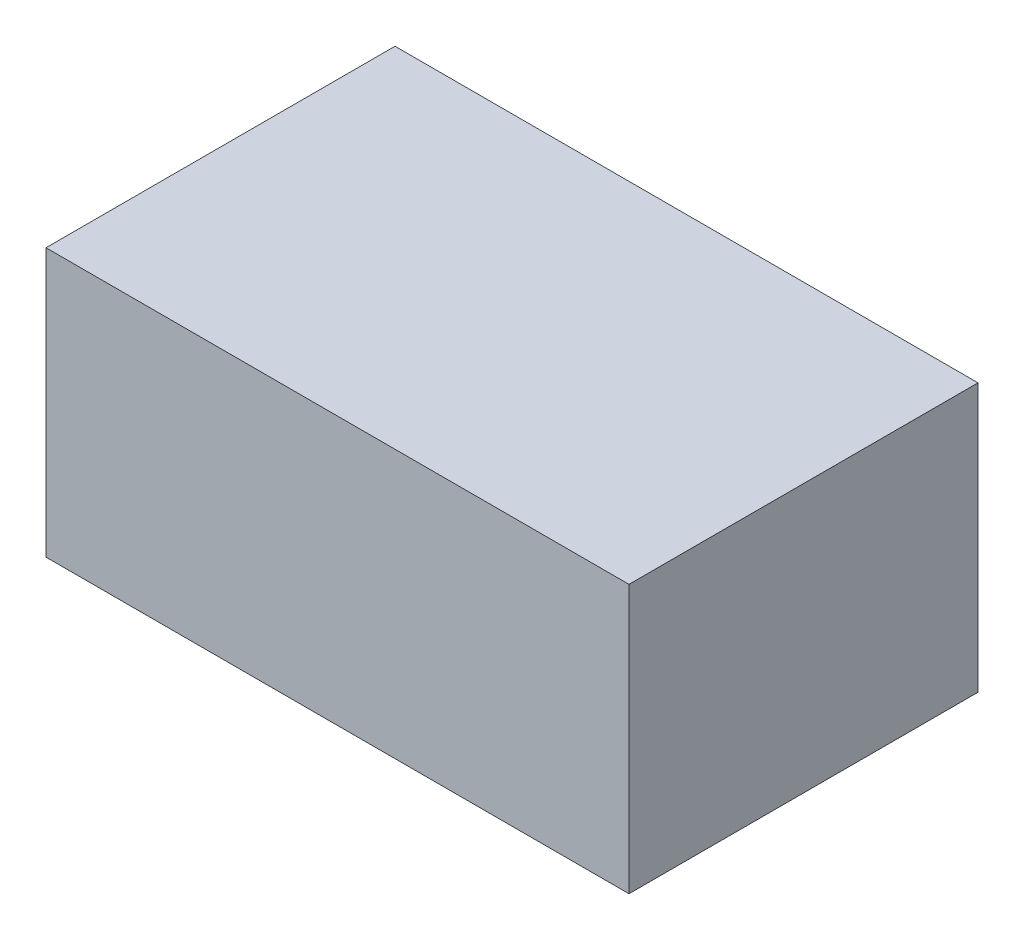
ISO-10303-21;
HEADER;
FILE_DESCRIPTION(('STEP AP214'),'2;1');
FILE_NAME('part.step','',(''),(''),'','','');
FILE_SCHEMA(('AUTOMOTIVE_DESIGN { 1 0 10303 214 1 1 1 1 }'));
ENDSEC;
DATA;
#1=APPLICATION_CONTEXT('core data for automotive mechanical design processes');
#2=APPLICATION_PROTOCOL_DEFINITION('international standard','automotive_design',2000,#1);
#3=PRODUCT_CONTEXT('',#1,'mechanical');
#4=PRODUCT('Part','Part','',(#3));
#5=PRODUCT_RELATED_PRODUCT_CATEGORY('part','',(#4));
#6=PRODUCT_DEFINITION_FORMATION('','',#4);
#7=PRODUCT_DEFINITION_CONTEXT('part definition',#1,'design');
#8=PRODUCT_DEFINITION('design','',#6,#7);
#9=PRODUCT_DEFINITION_SHAPE('','',#8);
#10=(LENGTH_UNIT() NAMED_UNIT(*) SI_UNIT(.MILLI.,.METRE.));
#11=(NAMED_UNIT(*) PLANE_ANGLE_UNIT() SI_UNIT($,.RADIAN.));
#12=(NAMED_UNIT(*) SI_UNIT($,.STERADIAN.) SOLID_ANGLE_UNIT());
#13=UNCERTAINTY_MEASURE_WITH_UNIT(LENGTH_MEASURE(1.E-05),#10,'distance_accuracy_value','');
#14=(GEOMETRIC_REPRESENTATION_CONTEXT(3) GLOBAL_UNCERTAINTY_ASSIGNED_CONTEXT((#13)) GLOBAL_UNIT_ASSIGNED_CONTEXT((#10,
#11,#12)) REPRESENTATION_CONTEXT('',''));
#15=CARTESIAN_POINT('',(0.,0.,0.));
#16=DIRECTION('',(0.,0.,1.));
#17=DIRECTION('',(1.,0.,0.));
#18=AXIS2_PLACEMENT_3D('',#15,#16,#17);
#19=CARTESIAN_POINT('',(22.3,-10.25,26.7));
#20=DIRECTION('',(-1.,0.,0.));
#21=DIRECTION('',(0.,0.,1.));
#22=AXIS2_PLACEMENT_3D('',#19,#20,#21);
#23=PLANE('',#22);
#24=DIRECTION('',(0.,1.,0.));
#25=VECTOR('',#24,1.);
#26=CARTESIAN_POINT('',(22.3,-10.25,0.));
#27=LINE('',#26,#25);
#28=CARTESIAN_POINT('',(22.3,-10.25,0.));
#29=VERTEX_POINT('',#28);
#30=CARTESIAN_POINT('',(22.3,10.25,0.));
#31=VERTEX_POINT('',#30);
#32=EDGE_CURVE('E111',#29,#31,#27,.T.);
#33=ORIENTED_EDGE('',*,*,#32,.T.);
#34=DIRECTION('',(0.,0.,-1.));
#35=VECTOR('',#34,1.);
#36=CARTESIAN_POINT('',(22.3,10.25,26.7));
#37=LINE('',#36,#35);
#38=CARTESIAN_POINT('',(22.3,10.25,26.7));
#39=VERTEX_POINT('',#38);
#40=EDGE_CURVE('E11',#39,#31,#37,.T.);
#41=ORIENTED_EDGE('',*,*,#40,.F.);
#42=DIRECTION('',(0.,1.,0.));
#43=VECTOR('',#42,1.);
#44=CARTESIAN_POINT('',(22.3,-10.25,26.7));
#45=LINE('',#44,#43);
#46=CARTESIAN_POINT('',(22.3,-10.25,26.7));
#47=VERTEX_POINT('',#46);
#48=EDGE_CURVE('E95',#47,#39,#45,.T.);
#49=ORIENTED_EDGE('',*,*,#48,.F.);
#50=DIRECTION('',(0.,0.,-1.));
#51=VECTOR('',#50,1.);
#52=CARTESIAN_POINT('',(22.3,-10.25,26.7));
#53=LINE('',#52,#51);
#54=EDGE_CURVE('E107',#47,#29,#53,.T.);
#55=ORIENTED_EDGE('',*,*,#54,.T.);
#56=EDGE_LOOP('',(#33,#41,#49,#55));
#57=FACE_BOUND('',#56,.T.);
#58=ADVANCED_FACE('F43',(#57),#23,.F.);
#59=CARTESIAN_POINT('',(-22.3,10.25,26.7));
#60=DIRECTION('',(0.,-1.,0.));
#61=DIRECTION('',(0.,0.,-1.));
#62=AXIS2_PLACEMENT_3D('',#59,#60,#61);
#63=PLANE('',#62);
#64=DIRECTION('',(-1.,0.,0.));
#65=VECTOR('',#64,1.);
#66=CARTESIAN_POINT('',(-22.3,10.25,0.));
#67=LINE('',#66,#65);
#68=CARTESIAN_POINT('',(-22.3,10.25,0.));
#69=VERTEX_POINT('',#68);
#70=EDGE_CURVE('E100',#31,#69,#67,.T.);
#71=ORIENTED_EDGE('',*,*,#70,.T.);
#72=DIRECTION('',(0.,0.,-1.));
#73=VECTOR('',#72,1.);
#74=CARTESIAN_POINT('',(-22.3,10.25,26.7));
#75=LINE('',#74,#73);
#76=CARTESIAN_POINT('',(-22.3,10.25,26.7));
#77=VERTEX_POINT('',#76);
#78=EDGE_CURVE('E52',#77,#69,#75,.T.);
#79=ORIENTED_EDGE('',*,*,#78,.F.);
#80=DIRECTION('',(-1.,0.,0.));
#81=VECTOR('',#80,1.);
#82=CARTESIAN_POINT('',(-22.3,10.25,26.7));
#83=LINE('',#82,#81);
#84=EDGE_CURVE('E90',#39,#77,#83,.T.);
#85=ORIENTED_EDGE('',*,*,#84,.F.);
#86=ORIENTED_EDGE('',*,*,#40,.T.);
#87=EDGE_LOOP('',(#71,#79,#85,#86));
#88=FACE_BOUND('',#87,.T.);
#89=ADVANCED_FACE('F99',(#88),#63,.F.);
#90=CARTESIAN_POINT('',(-22.3,-10.25,26.7));
#91=DIRECTION('',(1.,0.,0.));
#92=DIRECTION('',(0.,0.,-1.));
#93=AXIS2_PLACEMENT_3D('',#90,#91,#92);
#94=PLANE('',#93);
#95=DIRECTION('',(0.,-1.,0.));
#96=VECTOR('',#95,1.);
#97=CARTESIAN_POINT('',(-22.3,-10.25,0.));
#98=LINE('',#97,#96);
#99=CARTESIAN_POINT('',(-22.3,-10.25,0.));
#100=VERTEX_POINT('',#99);
#101=EDGE_CURVE('E77',#69,#100,#98,.T.);
#102=ORIENTED_EDGE('',*,*,#101,.T.);
#103=DIRECTION('',(0.,0.,-1.));
#104=VECTOR('',#103,1.);
#105=CARTESIAN_POINT('',(-22.3,-10.25,26.7));
#106=LINE('',#105,#104);
#107=CARTESIAN_POINT('',(-22.3,-10.25,26.7));
#108=VERTEX_POINT('',#107);
#109=EDGE_CURVE('E102',#108,#100,#106,.T.);
#110=ORIENTED_EDGE('',*,*,#109,.F.);
#111=DIRECTION('',(0.,-1.,0.));
#112=VECTOR('',#111,1.);
#113=CARTESIAN_POINT('',(-22.3,-10.25,26.7));
#114=LINE('',#113,#112);
#115=EDGE_CURVE('E93',#77,#108,#114,.T.);
#116=ORIENTED_EDGE('',*,*,#115,.F.);
#117=ORIENTED_EDGE('',*,*,#78,.T.);
#118=EDGE_LOOP('',(#102,#110,#116,#117));
#119=FACE_BOUND('',#118,.T.);
#120=ADVANCED_FACE('F103',(#119),#94,.F.);
#121=CARTESIAN_POINT('',(-22.3,-10.25,26.7));
#122=DIRECTION('',(0.,1.,0.));
#123=DIRECTION('',(0.,0.,1.));
#124=AXIS2_PLACEMENT_3D('',#121,#122,#123);
#125=PLANE('',#124);
#126=DIRECTION('',(1.,0.,0.));
#127=VECTOR('',#126,1.);
#128=CARTESIAN_POINT('',(-22.3,-10.25,0.));
#129=LINE('',#128,#127);
#130=EDGE_CURVE('E83',#100,#29,#129,.T.);
#131=ORIENTED_EDGE('',*,*,#130,.T.);
#132=ORIENTED_EDGE('',*,*,#54,.F.);
#133=DIRECTION('',(1.,0.,0.));
#134=VECTOR('',#133,1.);
#135=CARTESIAN_POINT('',(-22.3,-10.25,26.7));
#136=LINE('',#135,#134);
#137=EDGE_CURVE('E60',#108,#47,#136,.T.);
#138=ORIENTED_EDGE('',*,*,#137,.F.);
#139=ORIENTED_EDGE('',*,*,#109,.T.);
#140=EDGE_LOOP('',(#131,#132,#138,#139));
#141=FACE_BOUND('',#140,.T.);
#142=ADVANCED_FACE('F124',(#141),#125,.F.);
#143=CARTESIAN_POINT('',(0.,0.,26.7));
#144=DIRECTION('',(0.,0.,-1.));
#145=DIRECTION('',(-1.,0.,0.));
#146=AXIS2_PLACEMENT_3D('',#143,#144,#145);
#147=PLANE('',#146);
#148=ORIENTED_EDGE('',*,*,#48,.T.);
#149=ORIENTED_EDGE('',*,*,#84,.T.);
#150=ORIENTED_EDGE('',*,*,#115,.T.);
#151=ORIENTED_EDGE('',*,*,#137,.T.);
#152=EDGE_LOOP('',(#148,#149,#150,#151));
#153=FACE_BOUND('',#152,.T.);
#154=ADVANCED_FACE('F91',(#153),#147,.F.);
#155=CARTESIAN_POINT('',(0.,0.,0.));
#156=DIRECTION('',(0.,0.,-1.));
#157=DIRECTION('',(-1.,0.,0.));
#158=AXIS2_PLACEMENT_3D('',#155,#156,#157);
#159=PLANE('',#158);
#160=ORIENTED_EDGE('',*,*,#32,.F.);
#161=ORIENTED_EDGE('',*,*,#130,.F.);
#162=ORIENTED_EDGE('',*,*,#101,.F.);
#163=ORIENTED_EDGE('',*,*,#70,.F.);
#164=EDGE_LOOP('',(#160,#161,#162,#163));
#165=FACE_BOUND('',#164,.T.);
#166=ADVANCED_FACE('F127',(#165),#159,.T.);
#167=CLOSED_SHELL('',(#58,#89,#120,#142,#154,#166));
#168=MANIFOLD_SOLID_BREP('B2',#167);
#169=ADVANCED_BREP_SHAPE_REPRESENTATION('',(#18,#168),#14);
#170=SHAPE_DEFINITION_REPRESENTATION(#9,#169);
ENDSEC;
END-ISO-10303-21;
